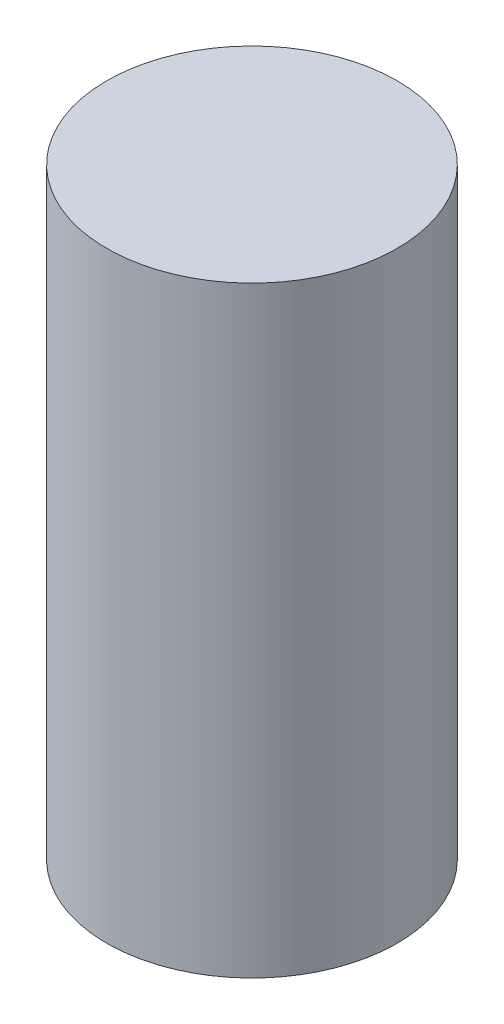
ISO-10303-21;
HEADER;
FILE_DESCRIPTION(('STEP AP214'),'2;1');
FILE_NAME('part.step','',(''),(''),'','','');
FILE_SCHEMA(('AUTOMOTIVE_DESIGN { 1 0 10303 214 1 1 1 1 }'));
ENDSEC;
DATA;
#1=APPLICATION_CONTEXT('core data for automotive mechanical design processes');
#2=APPLICATION_PROTOCOL_DEFINITION('international standard','automotive_design',2000,#1);
#3=PRODUCT_CONTEXT('',#1,'mechanical');
#4=PRODUCT('Part','Part','',(#3));
#5=PRODUCT_RELATED_PRODUCT_CATEGORY('part','',(#4));
#6=PRODUCT_DEFINITION_FORMATION('','',#4);
#7=PRODUCT_DEFINITION_CONTEXT('part definition',#1,'design');
#8=PRODUCT_DEFINITION('design','',#6,#7);
#9=PRODUCT_DEFINITION_SHAPE('','',#8);
#10=(LENGTH_UNIT() NAMED_UNIT(*) SI_UNIT(.MILLI.,.METRE.));
#11=(NAMED_UNIT(*) PLANE_ANGLE_UNIT() SI_UNIT($,.RADIAN.));
#12=(NAMED_UNIT(*) SI_UNIT($,.STERADIAN.) SOLID_ANGLE_UNIT());
#13=UNCERTAINTY_MEASURE_WITH_UNIT(LENGTH_MEASURE(1.E-05),#10,'distance_accuracy_value','');
#14=(GEOMETRIC_REPRESENTATION_CONTEXT(3) GLOBAL_UNCERTAINTY_ASSIGNED_CONTEXT((#13)) GLOBAL_UNIT_ASSIGNED_CONTEXT((#10,
#11,#12)) REPRESENTATION_CONTEXT('',''));
#15=CARTESIAN_POINT('',(0.,0.,0.));
#16=DIRECTION('',(0.,0.,1.));
#17=DIRECTION('',(1.,0.,0.));
#18=AXIS2_PLACEMENT_3D('',#15,#16,#17);
#19=CARTESIAN_POINT('',(0.,51.8,0.));
#20=DIRECTION('',(0.,-1.,0.));
#21=DIRECTION('',(0.,0.,-1.));
#22=AXIS2_PLACEMENT_3D('',#19,#20,#21);
#23=CYLINDRICAL_SURFACE('',#22,12.5);
#24=CARTESIAN_POINT('',(0.,51.8,0.));
#25=DIRECTION('',(0.,1.,0.));
#26=DIRECTION('',(0.,0.,1.));
#27=AXIS2_PLACEMENT_3D('',#24,#25,#26);
#28=CIRCLE('',#27,12.5);
#29=CARTESIAN_POINT('',(0.,51.8,-12.5));
#30=VERTEX_POINT('',#29);
#31=EDGE_CURVE('E10',#30,#30,#28,.T.);
#32=CARTESIAN_POINT('',(0.,0.,0.));
#33=DIRECTION('',(0.,1.,0.));
#34=DIRECTION('',(0.,0.,1.));
#35=AXIS2_PLACEMENT_3D('',#32,#33,#34);
#36=CIRCLE('',#35,12.5);
#37=CARTESIAN_POINT('',(0.,0.,-12.5));
#38=VERTEX_POINT('',#37);
#39=EDGE_CURVE('E34',#38,#38,#36,.T.);
#40=CARTESIAN_POINT('',(0.,51.8,-12.5));
#41=CARTESIAN_POINT('',(0.,51.2604166666667,-12.5));
#42=CARTESIAN_POINT('',(0.,50.7208333333333,-12.5));
#43=CARTESIAN_POINT('',(0.,49.6416666666667,-12.5));
#44=CARTESIAN_POINT('',(0.,49.1020833333333,-12.5));
#45=CARTESIAN_POINT('',(0.,48.0229166666667,-12.5));
#46=CARTESIAN_POINT('',(0.,47.4833333333333,-12.5));
#47=CARTESIAN_POINT('',(0.,46.4041666666667,-12.5));
#48=CARTESIAN_POINT('',(0.,45.8645833333333,-12.5));
#49=CARTESIAN_POINT('',(0.,44.7854166666667,-12.5));
#50=CARTESIAN_POINT('',(0.,44.2458333333333,-12.5));
#51=CARTESIAN_POINT('',(0.,43.1666666666667,-12.5));
#52=CARTESIAN_POINT('',(0.,42.6270833333333,-12.5));
#53=CARTESIAN_POINT('',(0.,41.5479166666667,-12.5));
#54=CARTESIAN_POINT('',(0.,41.0083333333333,-12.5));
#55=CARTESIAN_POINT('',(0.,39.9291666666667,-12.5));
#56=CARTESIAN_POINT('',(0.,39.3895833333333,-12.5));
#57=CARTESIAN_POINT('',(0.,38.3104166666667,-12.5));
#58=CARTESIAN_POINT('',(0.,37.7708333333333,-12.5));
#59=CARTESIAN_POINT('',(0.,36.6916666666667,-12.5));
#60=CARTESIAN_POINT('',(0.,36.1520833333333,-12.5));
#61=CARTESIAN_POINT('',(0.,35.0729166666667,-12.5));
#62=CARTESIAN_POINT('',(0.,34.5333333333333,-12.5));
#63=CARTESIAN_POINT('',(0.,33.4541666666667,-12.5));
#64=CARTESIAN_POINT('',(0.,32.9145833333333,-12.5));
#65=CARTESIAN_POINT('',(0.,31.8354166666667,-12.5));
#66=CARTESIAN_POINT('',(0.,31.2958333333333,-12.5));
#67=CARTESIAN_POINT('',(0.,30.2166666666667,-12.5));
#68=CARTESIAN_POINT('',(0.,29.6770833333333,-12.5));
#69=CARTESIAN_POINT('',(0.,28.5979166666667,-12.5));
#70=CARTESIAN_POINT('',(0.,28.0583333333333,-12.5));
#71=CARTESIAN_POINT('',(0.,26.9791666666667,-12.5));
#72=CARTESIAN_POINT('',(0.,26.4395833333333,-12.5));
#73=CARTESIAN_POINT('',(0.,25.3604166666667,-12.5));
#74=CARTESIAN_POINT('',(0.,24.8208333333333,-12.5));
#75=CARTESIAN_POINT('',(0.,23.7416666666667,-12.5));
#76=CARTESIAN_POINT('',(0.,23.2020833333333,-12.5));
#77=CARTESIAN_POINT('',(0.,22.1229166666667,-12.5));
#78=CARTESIAN_POINT('',(0.,21.5833333333333,-12.5));
#79=CARTESIAN_POINT('',(0.,20.5041666666667,-12.5));
#80=CARTESIAN_POINT('',(0.,19.9645833333333,-12.5));
#81=CARTESIAN_POINT('',(0.,18.8854166666667,-12.5));
#82=CARTESIAN_POINT('',(0.,18.3458333333333,-12.5));
#83=CARTESIAN_POINT('',(0.,17.2666666666667,-12.5));
#84=CARTESIAN_POINT('',(0.,16.7270833333333,-12.5));
#85=CARTESIAN_POINT('',(0.,15.6479166666667,-12.5));
#86=CARTESIAN_POINT('',(0.,15.1083333333333,-12.5));
#87=CARTESIAN_POINT('',(0.,14.0291666666667,-12.5));
#88=CARTESIAN_POINT('',(0.,13.4895833333333,-12.5));
#89=CARTESIAN_POINT('',(0.,12.4104166666667,-12.5));
#90=CARTESIAN_POINT('',(0.,11.8708333333333,-12.5));
#91=CARTESIAN_POINT('',(0.,10.7916666666667,-12.5));
#92=CARTESIAN_POINT('',(0.,10.2520833333333,-12.5));
#93=CARTESIAN_POINT('',(0.,9.17291666666666,-12.5));
#94=CARTESIAN_POINT('',(0.,8.63333333333333,-12.5));
#95=CARTESIAN_POINT('',(0.,7.55416666666666,-12.5));
#96=CARTESIAN_POINT('',(0.,7.01458333333333,-12.5));
#97=CARTESIAN_POINT('',(0.,5.93541666666666,-12.5));
#98=CARTESIAN_POINT('',(0.,5.39583333333333,-12.5));
#99=CARTESIAN_POINT('',(0.,4.31666666666666,-12.5));
#100=CARTESIAN_POINT('',(0.,3.77708333333332,-12.5));
#101=CARTESIAN_POINT('',(0.,2.69791666666666,-12.5));
#102=CARTESIAN_POINT('',(0.,2.15833333333333,-12.5));
#103=CARTESIAN_POINT('',(0.,1.07916666666666,-12.5));
#104=CARTESIAN_POINT('',(0.,0.539583333333327,-12.5));
#105=CARTESIAN_POINT('',(0.,0.,-12.5));
#106=B_SPLINE_CURVE_WITH_KNOTS('',3,(#40,#41,#42,#43,#44,#45,#46,#47,#48,#49,#50,#51,#52,#53,
#54,#55,#56,#57,#58,#59,#60,#61,#62,#63,#64,#65,#66,#67,#68,#69,#70,#71,#72,#73,#74,#75,#76,#77,
#78,#79,#80,#81,#82,#83,#84,#85,#86,#87,#88,#89,#90,#91,#92,#93,#94,#95,#96,#97,#98,#99,#100,
#101,#102,#103,#104,#105),.UNSPECIFIED.,.F.,.F.,(4,2,2,2,2,2,2,2,2,2,2,2,2,2,2,2,2,2,2,2,2,2,2,
2,2,2,2,2,2,2,2,2,4),(0.,1.61875,3.2375,4.85625,6.47499999999999,8.09375,9.71249999999999,
11.33125,12.95,14.56875,16.1875,17.80625,19.425,21.04375,22.6625,24.28125,25.9,27.51875,29.1375,
30.75625,32.375,33.99375,35.6125,37.23125,38.85,40.46875,42.0875,43.70625,45.325,46.94375,
48.5625,50.18125,51.8),.UNSPECIFIED.);
#107=EDGE_CURVE('BSEAM31',#30,#38,#106,.T.);
#108=ORIENTED_EDGE('',*,*,#31,.F.);
#109=ORIENTED_EDGE('',*,*,#39,.T.);
#110=ORIENTED_EDGE('',*,*,#107,.T.);
#111=ORIENTED_EDGE('',*,*,#107,.F.);
#112=EDGE_LOOP('',(#108,#110,#109,#111));
#113=FACE_BOUND('',#112,.T.);
#114=ADVANCED_FACE('F31',(#113),#23,.T.);
#115=CARTESIAN_POINT('',(0.,51.8,0.));
#116=DIRECTION('',(0.,1.,0.));
#117=DIRECTION('',(0.,0.,1.));
#118=AXIS2_PLACEMENT_3D('',#115,#116,#117);
#119=PLANE('',#118);
#120=ORIENTED_EDGE('',*,*,#31,.T.);
#121=EDGE_LOOP('',(#120));
#122=FACE_BOUND('',#121,.T.);
#123=ADVANCED_FACE('F46',(#122),#119,.T.);
#124=CARTESIAN_POINT('',(0.,0.,0.));
#125=DIRECTION('',(0.,1.,0.));
#126=DIRECTION('',(0.,0.,1.));
#127=AXIS2_PLACEMENT_3D('',#124,#125,#126);
#128=PLANE('',#127);
#129=ORIENTED_EDGE('',*,*,#39,.F.);
#130=EDGE_LOOP('',(#129));
#131=FACE_BOUND('',#130,.T.);
#132=ADVANCED_FACE('F44',(#131),#128,.F.);
#133=CLOSED_SHELL('',(#114,#123,#132));
#134=MANIFOLD_SOLID_BREP('B2',#133);
#135=ADVANCED_BREP_SHAPE_REPRESENTATION('',(#18,#134),#14);
#136=SHAPE_DEFINITION_REPRESENTATION(#9,#135);
ENDSEC;
END-ISO-10303-21;
